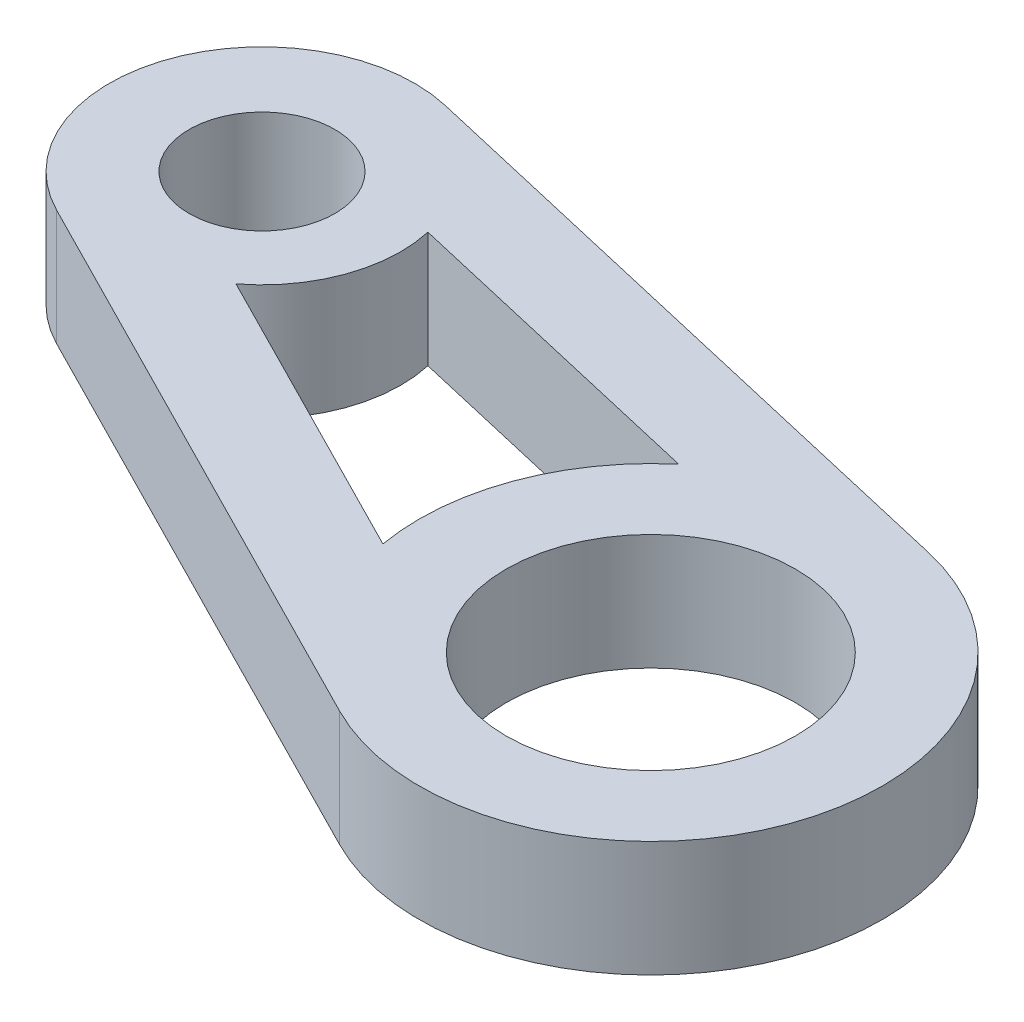
ISO-10303-21;
HEADER;
FILE_DESCRIPTION(('STEP AP214'),'2;1');
FILE_NAME('part.step','',(''),(''),'','','');
FILE_SCHEMA(('AUTOMOTIVE_DESIGN { 1 0 10303 214 1 1 1 1 }'));
ENDSEC;
DATA;
#1=APPLICATION_CONTEXT('core data for automotive mechanical design processes');
#2=APPLICATION_PROTOCOL_DEFINITION('international standard','automotive_design',2000,#1);
#3=PRODUCT_CONTEXT('',#1,'mechanical');
#4=PRODUCT('Part','Part','',(#3));
#5=PRODUCT_RELATED_PRODUCT_CATEGORY('part','',(#4));
#6=PRODUCT_DEFINITION_FORMATION('','',#4);
#7=PRODUCT_DEFINITION_CONTEXT('part definition',#1,'design');
#8=PRODUCT_DEFINITION('design','',#6,#7);
#9=PRODUCT_DEFINITION_SHAPE('','',#8);
#10=(LENGTH_UNIT() NAMED_UNIT(*) SI_UNIT(.MILLI.,.METRE.));
#11=(NAMED_UNIT(*) PLANE_ANGLE_UNIT() SI_UNIT($,.RADIAN.));
#12=(NAMED_UNIT(*) SI_UNIT($,.STERADIAN.) SOLID_ANGLE_UNIT());
#13=UNCERTAINTY_MEASURE_WITH_UNIT(LENGTH_MEASURE(1.E-05),#10,'distance_accuracy_value','');
#14=(GEOMETRIC_REPRESENTATION_CONTEXT(3) GLOBAL_UNCERTAINTY_ASSIGNED_CONTEXT((#13)) GLOBAL_UNIT_ASSIGNED_CONTEXT((#10,
#11,#12)) REPRESENTATION_CONTEXT('',''));
#15=CARTESIAN_POINT('',(0.,0.,0.));
#16=DIRECTION('',(0.,0.,1.));
#17=DIRECTION('',(1.,0.,0.));
#18=AXIS2_PLACEMENT_3D('',#15,#16,#17);
#19=CARTESIAN_POINT('',(16.764,3.175,6.096));
#20=DIRECTION('',(0.,-1.,0.));
#21=DIRECTION('',(0.,0.,-1.));
#22=AXIS2_PLACEMENT_3D('',#19,#20,#21);
#23=PLANE('',#22);
#24=CARTESIAN_POINT('',(16.764,3.175,6.096));
#25=DIRECTION('',(0.,1.,0.));
#26=DIRECTION('',(0.,0.,1.));
#27=AXIS2_PLACEMENT_3D('',#24,#25,#26);
#28=CIRCLE('',#27,3.96875);
#29=CARTESIAN_POINT('',(16.764,3.175,10.06475));
#30=VERTEX_POINT('',#29);
#31=EDGE_CURVE('E137',#30,#30,#28,.T.);
#32=ORIENTED_EDGE('',*,*,#31,.F.);
#33=EDGE_LOOP('',(#32));
#34=FACE_BOUND('',#33,.T.);
#35=CARTESIAN_POINT('',(0.,3.175,0.));
#36=DIRECTION('',(0.,1.,0.));
#37=DIRECTION('',(0.,0.,1.));
#38=AXIS2_PLACEMENT_3D('',#35,#36,#37);
#39=CIRCLE('',#38,2.);
#40=CARTESIAN_POINT('',(0.,3.175,2.));
#41=VERTEX_POINT('',#40);
#42=EDGE_CURVE('E143',#41,#41,#39,.T.);
#43=ORIENTED_EDGE('',*,*,#42,.F.);
#44=EDGE_LOOP('',(#43));
#45=FACE_BOUND('',#44,.T.);
#46=CARTESIAN_POINT('',(16.764,3.175,6.096));
#47=DIRECTION('',(0.,1.,0.));
#48=DIRECTION('',(0.,0.,-1.));
#49=AXIS2_PLACEMENT_3D('',#46,#47,#48);
#50=CIRCLE('',#49,6.35);
#51=CARTESIAN_POINT('',(13.8875919198479,3.175,11.757163887085));
#52=VERTEX_POINT('',#51);
#53=CARTESIAN_POINT('',(18.1958217054563,3.175,-0.0904680233380604));
#54=VERTEX_POINT('',#53);
#55=EDGE_CURVE('E149',#52,#54,#50,.T.);
#56=ORIENTED_EDGE('',*,*,#55,.T.);
#57=DIRECTION('',(-0.974246932809143,0.,-0.225483733142719));
#58=VECTOR('',#57,1.);
#59=CARTESIAN_POINT('',(18.1958217054563,3.175,-0.0904680233380604));
#60=LINE('',#59,#58);
#61=CARTESIAN_POINT('',(0.945002325601135,3.175,-4.08306889540312));
#62=VERTEX_POINT('',#61);
#63=EDGE_CURVE('E152',#54,#62,#60,.T.);
#64=ORIENTED_EDGE('',*,*,#63,.T.);
#65=CARTESIAN_POINT('',(0.,3.175,0.));
#66=DIRECTION('',(0.,1.,0.));
#67=DIRECTION('',(0.,0.,-1.));
#68=AXIS2_PLACEMENT_3D('',#65,#66,#67);
#69=CIRCLE('',#68,4.191);
#70=CARTESIAN_POINT('',(-1.8984293329004,3.175,3.73636816547611));
#71=VERTEX_POINT('',#70);
#72=EDGE_CURVE('E155',#62,#71,#69,.T.);
#73=ORIENTED_EDGE('',*,*,#72,.T.);
#74=DIRECTION('',(0.891521871981893,0.,0.452977650417658));
#75=VECTOR('',#74,1.);
#76=CARTESIAN_POINT('',(13.8875919198479,3.175,11.757163887085));
#77=LINE('',#76,#75);
#78=EDGE_CURVE('E157',#71,#52,#77,.T.);
#79=ORIENTED_EDGE('',*,*,#78,.T.);
#80=EDGE_LOOP('',(#56,#64,#73,#79));
#81=FACE_BOUND('',#80,.T.);
#82=CARTESIAN_POINT('',(16.764,3.175,6.096));
#83=DIRECTION('',(0.,-1.,0.));
#84=DIRECTION('',(0.,0.,1.));
#85=AXIS2_PLACEMENT_3D('',#82,#83,#84);
#86=CIRCLE('',#85,6.35);
#87=CARTESIAN_POINT('',(10.5092240422407,3.175,7.19157186812931));
#88=VERTEX_POINT('',#87);
#89=CARTESIAN_POINT('',(12.6739186046033,3.175,1.23866182163215));
#90=VERTEX_POINT('',#89);
#91=EDGE_CURVE('E101',#88,#90,#86,.T.);
#92=ORIENTED_EDGE('',*,*,#91,.F.);
#93=DIRECTION('',(0.891521871981893,0.,0.452977650417657));
#94=VECTOR('',#93,1.);
#95=CARTESIAN_POINT('',(10.5092240422407,3.175,7.19157186812931));
#96=LINE('',#95,#94);
#97=CARTESIAN_POINT('',(2.31335298068691,3.175,3.0272921872107));
#98=VERTEX_POINT('',#97);
#99=EDGE_CURVE('E123',#98,#88,#96,.T.);
#100=ORIENTED_EDGE('',*,*,#99,.F.);
#101=CARTESIAN_POINT('',(0.,3.175,0.));
#102=DIRECTION('',(0.,-1.,0.));
#103=DIRECTION('',(0.,0.,1.));
#104=AXIS2_PLACEMENT_3D('',#101,#102,#103);
#105=CIRCLE('',#104,3.81);
#106=CARTESIAN_POINT('',(3.71754580618006,3.175,-0.83423808289544));
#107=VERTEX_POINT('',#106);
#108=EDGE_CURVE('E121',#107,#98,#105,.T.);
#109=ORIENTED_EDGE('',*,*,#108,.F.);
#110=DIRECTION('',(-0.974246932809143,0.,-0.225483733142719));
#111=VECTOR('',#110,1.);
#112=CARTESIAN_POINT('',(12.6739186046033,3.175,1.23866182163215));
#113=LINE('',#112,#111);
#114=EDGE_CURVE('E109',#90,#107,#113,.T.);
#115=ORIENTED_EDGE('',*,*,#114,.F.);
#116=EDGE_LOOP('',(#92,#100,#109,#115));
#117=FACE_BOUND('',#116,.T.);
#118=ADVANCED_FACE('F36',(#34,#45,#81,#117),#23,.F.);
#119=CARTESIAN_POINT('',(16.764,0.,6.096));
#120=DIRECTION('',(0.,-1.,0.));
#121=DIRECTION('',(0.,0.,-1.));
#122=AXIS2_PLACEMENT_3D('',#119,#120,#121);
#123=PLANE('',#122);
#124=CARTESIAN_POINT('',(0.,0.,0.));
#125=DIRECTION('',(0.,1.,0.));
#126=DIRECTION('',(0.,0.,1.));
#127=AXIS2_PLACEMENT_3D('',#124,#125,#126);
#128=CIRCLE('',#127,2.);
#129=CARTESIAN_POINT('',(0.,0.,2.));
#130=VERTEX_POINT('',#129);
#131=EDGE_CURVE('E140',#130,#130,#128,.T.);
#132=ORIENTED_EDGE('',*,*,#131,.T.);
#133=EDGE_LOOP('',(#132));
#134=FACE_BOUND('',#133,.T.);
#135=CARTESIAN_POINT('',(16.764,0.,6.096));
#136=DIRECTION('',(0.,1.,0.));
#137=DIRECTION('',(0.,0.,-1.));
#138=AXIS2_PLACEMENT_3D('',#135,#136,#137);
#139=CIRCLE('',#138,6.35);
#140=CARTESIAN_POINT('',(13.8875919198479,0.,11.757163887085));
#141=VERTEX_POINT('',#140);
#142=CARTESIAN_POINT('',(18.1958217054563,0.,-0.0904680233380604));
#143=VERTEX_POINT('',#142);
#144=EDGE_CURVE('E146',#141,#143,#139,.T.);
#145=ORIENTED_EDGE('',*,*,#144,.F.);
#146=DIRECTION('',(0.891521871981893,0.,0.452977650417658));
#147=VECTOR('',#146,1.);
#148=CARTESIAN_POINT('',(13.8875919198479,0.,11.757163887085));
#149=LINE('',#148,#147);
#150=CARTESIAN_POINT('',(-1.8984293329004,0.,3.73636816547611));
#151=VERTEX_POINT('',#150);
#152=EDGE_CURVE('E153',#151,#141,#149,.T.);
#153=ORIENTED_EDGE('',*,*,#152,.F.);
#154=CARTESIAN_POINT('',(0.,0.,0.));
#155=DIRECTION('',(0.,1.,0.));
#156=DIRECTION('',(0.,0.,-1.));
#157=AXIS2_PLACEMENT_3D('',#154,#155,#156);
#158=CIRCLE('',#157,4.191);
#159=CARTESIAN_POINT('',(0.945002325601135,0.,-4.08306889540312));
#160=VERTEX_POINT('',#159);
#161=EDGE_CURVE('E164',#160,#151,#158,.T.);
#162=ORIENTED_EDGE('',*,*,#161,.F.);
#163=DIRECTION('',(-0.974246932809143,0.,-0.225483733142719));
#164=VECTOR('',#163,1.);
#165=CARTESIAN_POINT('',(18.1958217054563,0.,-0.0904680233380604));
#166=LINE('',#165,#164);
#167=EDGE_CURVE('E162',#143,#160,#166,.T.);
#168=ORIENTED_EDGE('',*,*,#167,.F.);
#169=EDGE_LOOP('',(#145,#153,#162,#168));
#170=FACE_BOUND('',#169,.T.);
#171=CARTESIAN_POINT('',(16.764,0.,6.096));
#172=DIRECTION('',(0.,1.,0.));
#173=DIRECTION('',(0.,0.,1.));
#174=AXIS2_PLACEMENT_3D('',#171,#172,#173);
#175=CIRCLE('',#174,3.96875);
#176=CARTESIAN_POINT('',(16.764,0.,10.06475));
#177=VERTEX_POINT('',#176);
#178=EDGE_CURVE('E117',#177,#177,#175,.T.);
#179=ORIENTED_EDGE('',*,*,#178,.T.);
#180=EDGE_LOOP('',(#179));
#181=FACE_BOUND('',#180,.T.);
#182=DIRECTION('',(0.891521871981893,0.,0.452977650417657));
#183=VECTOR('',#182,1.);
#184=CARTESIAN_POINT('',(10.5092240422407,0.,7.19157186812931));
#185=LINE('',#184,#183);
#186=CARTESIAN_POINT('',(2.31335298068691,0.,3.0272921872107));
#187=VERTEX_POINT('',#186);
#188=CARTESIAN_POINT('',(10.5092240422407,0.,7.19157186812931));
#189=VERTEX_POINT('',#188);
#190=EDGE_CURVE('E110',#187,#189,#185,.T.);
#191=ORIENTED_EDGE('',*,*,#190,.T.);
#192=CARTESIAN_POINT('',(16.764,0.,6.096));
#193=DIRECTION('',(0.,-1.,0.));
#194=DIRECTION('',(0.,0.,1.));
#195=AXIS2_PLACEMENT_3D('',#192,#193,#194);
#196=CIRCLE('',#195,6.35);
#197=CARTESIAN_POINT('',(12.6739186046033,0.,1.23866182163215));
#198=VERTEX_POINT('',#197);
#199=EDGE_CURVE('E59',#189,#198,#196,.T.);
#200=ORIENTED_EDGE('',*,*,#199,.T.);
#201=DIRECTION('',(-0.974246932809143,0.,-0.225483733142719));
#202=VECTOR('',#201,1.);
#203=CARTESIAN_POINT('',(12.6739186046033,0.,1.23866182163215));
#204=LINE('',#203,#202);
#205=CARTESIAN_POINT('',(3.71754580618006,0.,-0.83423808289544));
#206=VERTEX_POINT('',#205);
#207=EDGE_CURVE('E116',#198,#206,#204,.T.);
#208=ORIENTED_EDGE('',*,*,#207,.T.);
#209=CARTESIAN_POINT('',(0.,0.,0.));
#210=DIRECTION('',(0.,-1.,0.));
#211=DIRECTION('',(0.,0.,1.));
#212=AXIS2_PLACEMENT_3D('',#209,#210,#211);
#213=CIRCLE('',#212,3.81);
#214=EDGE_CURVE('E129',#206,#187,#213,.T.);
#215=ORIENTED_EDGE('',*,*,#214,.T.);
#216=EDGE_LOOP('',(#191,#200,#208,#215));
#217=FACE_BOUND('',#216,.T.);
#218=ADVANCED_FACE('F182',(#134,#170,#181,#217),#123,.T.);
#219=CARTESIAN_POINT('',(16.764,3.175,6.096));
#220=DIRECTION('',(0.,-1.,0.));
#221=DIRECTION('',(0.,0.,-1.));
#222=AXIS2_PLACEMENT_3D('',#219,#220,#221);
#223=CYLINDRICAL_SURFACE('',#222,6.35);
#224=ORIENTED_EDGE('',*,*,#144,.T.);
#225=DIRECTION('',(0.,-1.,0.));
#226=VECTOR('',#225,1.);
#227=CARTESIAN_POINT('',(18.1958217054563,3.175,-0.0904680233380604));
#228=LINE('',#227,#226);
#229=EDGE_CURVE('E11',#54,#143,#228,.T.);
#230=ORIENTED_EDGE('',*,*,#229,.F.);
#231=ORIENTED_EDGE('',*,*,#55,.F.);
#232=DIRECTION('',(0.,-1.,0.));
#233=VECTOR('',#232,1.);
#234=CARTESIAN_POINT('',(13.8875919198479,3.175,11.757163887085));
#235=LINE('',#234,#233);
#236=EDGE_CURVE('E159',#52,#141,#235,.T.);
#237=ORIENTED_EDGE('',*,*,#236,.T.);
#238=EDGE_LOOP('',(#224,#230,#231,#237));
#239=FACE_BOUND('',#238,.T.);
#240=ADVANCED_FACE('F38',(#239),#223,.T.);
#241=CARTESIAN_POINT('',(18.1958217054563,3.175,-0.0904680233380604));
#242=DIRECTION('',(-0.225483733142719,0.,0.974246932809143));
#243=DIRECTION('',(0.974246932809143,0.,0.225483733142719));
#244=AXIS2_PLACEMENT_3D('',#241,#242,#243);
#245=PLANE('',#244);
#246=ORIENTED_EDGE('',*,*,#167,.T.);
#247=DIRECTION('',(0.,-1.,0.));
#248=VECTOR('',#247,1.);
#249=CARTESIAN_POINT('',(0.945002325601135,3.175,-4.08306889540312));
#250=LINE('',#249,#248);
#251=EDGE_CURVE('E44',#62,#160,#250,.T.);
#252=ORIENTED_EDGE('',*,*,#251,.F.);
#253=ORIENTED_EDGE('',*,*,#63,.F.);
#254=ORIENTED_EDGE('',*,*,#229,.T.);
#255=EDGE_LOOP('',(#246,#252,#253,#254));
#256=FACE_BOUND('',#255,.T.);
#257=ADVANCED_FACE('F192',(#256),#245,.F.);
#258=CARTESIAN_POINT('',(0.,3.175,0.));
#259=DIRECTION('',(0.,-1.,0.));
#260=DIRECTION('',(0.,0.,-1.));
#261=AXIS2_PLACEMENT_3D('',#258,#259,#260);
#262=CYLINDRICAL_SURFACE('',#261,4.191);
#263=ORIENTED_EDGE('',*,*,#161,.T.);
#264=DIRECTION('',(0.,-1.,0.));
#265=VECTOR('',#264,1.);
#266=CARTESIAN_POINT('',(-1.8984293329004,3.175,3.73636816547611));
#267=LINE('',#266,#265);
#268=EDGE_CURVE('E169',#71,#151,#267,.T.);
#269=ORIENTED_EDGE('',*,*,#268,.F.);
#270=ORIENTED_EDGE('',*,*,#72,.F.);
#271=ORIENTED_EDGE('',*,*,#251,.T.);
#272=EDGE_LOOP('',(#263,#269,#270,#271));
#273=FACE_BOUND('',#272,.T.);
#274=ADVANCED_FACE('F176',(#273),#262,.T.);
#275=CARTESIAN_POINT('',(13.8875919198479,3.175,11.757163887085));
#276=DIRECTION('',(0.452977650417658,0.,-0.891521871981893));
#277=DIRECTION('',(-0.891521871981893,0.,-0.452977650417658));
#278=AXIS2_PLACEMENT_3D('',#275,#276,#277);
#279=PLANE('',#278);
#280=ORIENTED_EDGE('',*,*,#152,.T.);
#281=ORIENTED_EDGE('',*,*,#236,.F.);
#282=ORIENTED_EDGE('',*,*,#78,.F.);
#283=ORIENTED_EDGE('',*,*,#268,.T.);
#284=EDGE_LOOP('',(#280,#281,#282,#283));
#285=FACE_BOUND('',#284,.T.);
#286=ADVANCED_FACE('F186',(#285),#279,.F.);
#287=CARTESIAN_POINT('',(0.,3.175,0.));
#288=DIRECTION('',(0.,-1.,0.));
#289=DIRECTION('',(0.,0.,-1.));
#290=AXIS2_PLACEMENT_3D('',#287,#288,#289);
#291=CYLINDRICAL_SURFACE('',#290,2.);
#292=ORIENTED_EDGE('',*,*,#42,.T.);
#293=EDGE_LOOP('',(#292));
#294=FACE_BOUND('',#293,.T.);
#295=ORIENTED_EDGE('',*,*,#131,.F.);
#296=EDGE_LOOP('',(#295));
#297=FACE_BOUND('',#296,.T.);
#298=ADVANCED_FACE('F210',(#294,#297),#291,.F.);
#299=CARTESIAN_POINT('',(16.764,3.175,6.096));
#300=DIRECTION('',(0.,-1.,0.));
#301=DIRECTION('',(0.,0.,-1.));
#302=AXIS2_PLACEMENT_3D('',#299,#300,#301);
#303=CYLINDRICAL_SURFACE('',#302,3.96875);
#304=ORIENTED_EDGE('',*,*,#31,.T.);
#305=EDGE_LOOP('',(#304));
#306=FACE_BOUND('',#305,.T.);
#307=ORIENTED_EDGE('',*,*,#178,.F.);
#308=EDGE_LOOP('',(#307));
#309=FACE_BOUND('',#308,.T.);
#310=ADVANCED_FACE('F217',(#306,#309),#303,.F.);
#311=CARTESIAN_POINT('',(16.764,3.175,6.096));
#312=DIRECTION('',(0.,-1.,0.));
#313=DIRECTION('',(0.,0.,-1.));
#314=AXIS2_PLACEMENT_3D('',#311,#312,#313);
#315=CYLINDRICAL_SURFACE('',#314,6.35);
#316=ORIENTED_EDGE('',*,*,#199,.F.);
#317=DIRECTION('',(0.,-1.,0.));
#318=VECTOR('',#317,1.);
#319=CARTESIAN_POINT('',(10.5092240422407,3.175,7.19157186812931));
#320=LINE('',#319,#318);
#321=EDGE_CURVE('E105',#88,#189,#320,.T.);
#322=ORIENTED_EDGE('',*,*,#321,.F.);
#323=ORIENTED_EDGE('',*,*,#91,.T.);
#324=DIRECTION('',(0.,-1.,0.));
#325=VECTOR('',#324,1.);
#326=CARTESIAN_POINT('',(12.6739186046033,3.175,1.23866182163215));
#327=LINE('',#326,#325);
#328=EDGE_CURVE('E104',#90,#198,#327,.T.);
#329=ORIENTED_EDGE('',*,*,#328,.T.);
#330=EDGE_LOOP('',(#316,#322,#323,#329));
#331=FACE_BOUND('',#330,.T.);
#332=ADVANCED_FACE('F103',(#331),#315,.T.);
#333=CARTESIAN_POINT('',(12.6739186046033,3.175,1.23866182163215));
#334=DIRECTION('',(-0.225483733142719,0.,0.974246932809143));
#335=DIRECTION('',(0.974246932809143,0.,0.225483733142719));
#336=AXIS2_PLACEMENT_3D('',#333,#334,#335);
#337=PLANE('',#336);
#338=ORIENTED_EDGE('',*,*,#207,.F.);
#339=ORIENTED_EDGE('',*,*,#328,.F.);
#340=ORIENTED_EDGE('',*,*,#114,.T.);
#341=DIRECTION('',(0.,-1.,0.));
#342=VECTOR('',#341,1.);
#343=CARTESIAN_POINT('',(3.71754580618006,3.175,-0.83423808289544));
#344=LINE('',#343,#342);
#345=EDGE_CURVE('E118',#107,#206,#344,.T.);
#346=ORIENTED_EDGE('',*,*,#345,.T.);
#347=EDGE_LOOP('',(#338,#339,#340,#346));
#348=FACE_BOUND('',#347,.T.);
#349=ADVANCED_FACE('F113',(#348),#337,.T.);
#350=CARTESIAN_POINT('',(0.,3.175,0.));
#351=DIRECTION('',(0.,-1.,0.));
#352=DIRECTION('',(0.,0.,-1.));
#353=AXIS2_PLACEMENT_3D('',#350,#351,#352);
#354=CYLINDRICAL_SURFACE('',#353,3.81);
#355=ORIENTED_EDGE('',*,*,#214,.F.);
#356=ORIENTED_EDGE('',*,*,#345,.F.);
#357=ORIENTED_EDGE('',*,*,#108,.T.);
#358=DIRECTION('',(0.,-1.,0.));
#359=VECTOR('',#358,1.);
#360=CARTESIAN_POINT('',(2.31335298068691,3.175,3.0272921872107));
#361=LINE('',#360,#359);
#362=EDGE_CURVE('E51',#98,#187,#361,.T.);
#363=ORIENTED_EDGE('',*,*,#362,.T.);
#364=EDGE_LOOP('',(#355,#356,#357,#363));
#365=FACE_BOUND('',#364,.T.);
#366=ADVANCED_FACE('F234',(#365),#354,.T.);
#367=CARTESIAN_POINT('',(10.5092240422407,3.175,7.19157186812931));
#368=DIRECTION('',(0.452977650417657,0.,-0.891521871981893));
#369=DIRECTION('',(-0.891521871981893,0.,-0.452977650417658));
#370=AXIS2_PLACEMENT_3D('',#367,#368,#369);
#371=PLANE('',#370);
#372=ORIENTED_EDGE('',*,*,#190,.F.);
#373=ORIENTED_EDGE('',*,*,#362,.F.);
#374=ORIENTED_EDGE('',*,*,#99,.T.);
#375=ORIENTED_EDGE('',*,*,#321,.T.);
#376=EDGE_LOOP('',(#372,#373,#374,#375));
#377=FACE_BOUND('',#376,.T.);
#378=ADVANCED_FACE('F237',(#377),#371,.T.);
#379=CLOSED_SHELL('',(#118,#218,#240,#257,#274,#286,#298,#310,#332,#349,#366,#378));
#380=MANIFOLD_SOLID_BREP('B2',#379);
#381=ADVANCED_BREP_SHAPE_REPRESENTATION('',(#18,#380),#14);
#382=SHAPE_DEFINITION_REPRESENTATION(#9,#381);
ENDSEC;
END-ISO-10303-21;
